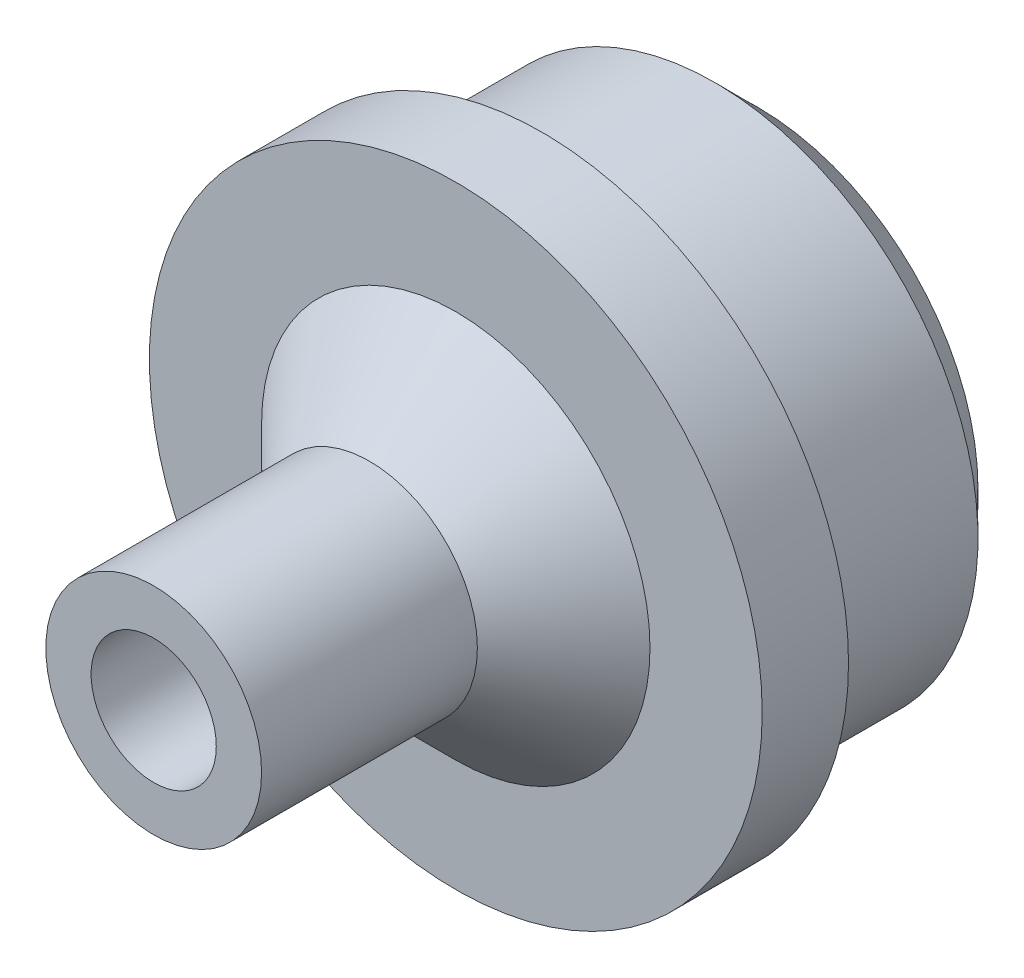
ISO-10303-21;
HEADER;
FILE_DESCRIPTION(('STEP AP214'),'2;1');
FILE_NAME('part.step','',(''),(''),'','','');
FILE_SCHEMA(('AUTOMOTIVE_DESIGN { 1 0 10303 214 1 1 1 1 }'));
ENDSEC;
DATA;
#1=APPLICATION_CONTEXT('core data for automotive mechanical design processes');
#2=APPLICATION_PROTOCOL_DEFINITION('international standard','automotive_design',2000,#1);
#3=PRODUCT_CONTEXT('',#1,'mechanical');
#4=PRODUCT('Part','Part','',(#3));
#5=PRODUCT_RELATED_PRODUCT_CATEGORY('part','',(#4));
#6=PRODUCT_DEFINITION_FORMATION('','',#4);
#7=PRODUCT_DEFINITION_CONTEXT('part definition',#1,'design');
#8=PRODUCT_DEFINITION('design','',#6,#7);
#9=PRODUCT_DEFINITION_SHAPE('','',#8);
#10=(LENGTH_UNIT() NAMED_UNIT(*) SI_UNIT(.MILLI.,.METRE.));
#11=(NAMED_UNIT(*) PLANE_ANGLE_UNIT() SI_UNIT($,.RADIAN.));
#12=(NAMED_UNIT(*) SI_UNIT($,.STERADIAN.) SOLID_ANGLE_UNIT());
#13=UNCERTAINTY_MEASURE_WITH_UNIT(LENGTH_MEASURE(1.E-05),#10,'distance_accuracy_value','');
#14=(GEOMETRIC_REPRESENTATION_CONTEXT(3) GLOBAL_UNCERTAINTY_ASSIGNED_CONTEXT((#13)) GLOBAL_UNIT_ASSIGNED_CONTEXT((#10,
#11,#12)) REPRESENTATION_CONTEXT('',''));
#15=CARTESIAN_POINT('',(0.,0.,0.));
#16=DIRECTION('',(0.,0.,1.));
#17=DIRECTION('',(1.,0.,0.));
#18=AXIS2_PLACEMENT_3D('',#15,#16,#17);
#19=CARTESIAN_POINT('',(0.,-0.874999999999985,-5.));
#20=DIRECTION('',(0.,-1.,0.));
#21=DIRECTION('',(1.,0.,0.));
#22=AXIS2_PLACEMENT_3D('',#19,#20,#21);
#23=PLANE('',#22);
#24=DIRECTION('',(1.,0.,0.));
#25=VECTOR('',#24,1.);
#26=CARTESIAN_POINT('',(0.,-0.874999999999985,0.));
#27=LINE('',#26,#25);
#28=CARTESIAN_POINT('',(-6.35,-0.875,0.));
#29=VERTEX_POINT('',#28);
#30=CARTESIAN_POINT('',(-6.03691767378022,-0.874999999999999,0.));
#31=VERTEX_POINT('',#30);
#32=EDGE_CURVE('E88',#29,#31,#27,.T.);
#33=ORIENTED_EDGE('',*,*,#32,.F.);
#34=DIRECTION('',(0.,0.,1.));
#35=VECTOR('',#34,1.);
#36=CARTESIAN_POINT('',(-6.35,-0.875,-5.));
#37=LINE('',#36,#35);
#38=CARTESIAN_POINT('',(-6.35,-0.875,-5.));
#39=VERTEX_POINT('',#38);
#40=EDGE_CURVE('E90',#39,#29,#37,.T.);
#41=ORIENTED_EDGE('',*,*,#40,.F.);
#42=DIRECTION('',(1.,0.,0.));
#43=VECTOR('',#42,1.);
#44=CARTESIAN_POINT('',(0.,-0.874999999999985,-5.));
#45=LINE('',#44,#43);
#46=CARTESIAN_POINT('',(-5.0243780709656,-0.874999999999997,-5.));
#47=VERTEX_POINT('',#46);
#48=EDGE_CURVE('E65',#39,#47,#45,.T.);
#49=ORIENTED_EDGE('',*,*,#48,.T.);
#50=CARTESIAN_POINT('',(-5.0243780709656,-0.874999999999997,-5.));
#51=CARTESIAN_POINT('',(-5.19332243294403,-0.874999999999997,-4.83352343973465));
#52=CARTESIAN_POINT('',(-5.36217291655565,-0.874999999999998,-4.66695182390504));
#53=CARTESIAN_POINT('',(-5.69968611748322,-0.874999999999998,-4.33361849056093));
#54=CARTESIAN_POINT('',(-5.86834883480981,-0.874999999999999,-4.16685677305721));
#55=CARTESIAN_POINT('',(-6.03691767378022,-0.874999999999999,-4.));
#56=B_SPLINE_CURVE_WITH_KNOTS('',3,(#50,#51,#52,#53,#54,#55),.UNSPECIFIED.,.F.,.F.,(4,2,4),(0.,
0.711554144913555,1.4231082495093),.UNSPECIFIED.);
#57=CARTESIAN_POINT('',(-6.03691767378022,-0.874999999999999,-4.));
#58=VERTEX_POINT('',#57);
#59=EDGE_CURVE('E11',#47,#58,#56,.T.);
#60=ORIENTED_EDGE('',*,*,#59,.T.);
#61=DIRECTION('',(0.,0.,1.));
#62=VECTOR('',#61,1.);
#63=CARTESIAN_POINT('',(-6.03691767378022,-0.874999999999999,-5.));
#64=LINE('',#63,#62);
#65=EDGE_CURVE('E92',#58,#31,#64,.T.);
#66=ORIENTED_EDGE('',*,*,#65,.T.);
#67=EDGE_LOOP('',(#33,#41,#49,#60,#66));
#68=FACE_BOUND('',#67,.T.);
#69=ADVANCED_FACE('F36',(#68),#23,.T.);
#70=CARTESIAN_POINT('',(-6.35,0.,-5.));
#71=DIRECTION('',(-1.,0.,0.));
#72=DIRECTION('',(0.,0.,1.));
#73=AXIS2_PLACEMENT_3D('',#70,#71,#72);
#74=PLANE('',#73);
#75=DIRECTION('',(0.,-1.,0.));
#76=VECTOR('',#75,1.);
#77=CARTESIAN_POINT('',(-6.35,0.,0.));
#78=LINE('',#77,#76);
#79=CARTESIAN_POINT('',(-6.35,0.875,0.));
#80=VERTEX_POINT('',#79);
#81=EDGE_CURVE('E104',#80,#29,#78,.T.);
#82=ORIENTED_EDGE('',*,*,#81,.F.);
#83=DIRECTION('',(0.,0.,1.));
#84=VECTOR('',#83,1.);
#85=CARTESIAN_POINT('',(-6.35,0.875,-5.));
#86=LINE('',#85,#84);
#87=CARTESIAN_POINT('',(-6.35,0.875,-5.));
#88=VERTEX_POINT('',#87);
#89=EDGE_CURVE('E108',#88,#80,#86,.T.);
#90=ORIENTED_EDGE('',*,*,#89,.F.);
#91=DIRECTION('',(0.,-1.,0.));
#92=VECTOR('',#91,1.);
#93=CARTESIAN_POINT('',(-6.35,0.,-5.));
#94=LINE('',#93,#92);
#95=EDGE_CURVE('E106',#88,#39,#94,.T.);
#96=ORIENTED_EDGE('',*,*,#95,.T.);
#97=ORIENTED_EDGE('',*,*,#40,.T.);
#98=EDGE_LOOP('',(#82,#90,#96,#97));
#99=FACE_BOUND('',#98,.T.);
#100=ADVANCED_FACE('F103',(#99),#74,.T.);
#101=CARTESIAN_POINT('',(0.,0.875,-5.));
#102=DIRECTION('',(0.,1.,0.));
#103=DIRECTION('',(0.,0.,1.));
#104=AXIS2_PLACEMENT_3D('',#101,#102,#103);
#105=PLANE('',#104);
#106=DIRECTION('',(-1.,0.,0.));
#107=VECTOR('',#106,1.);
#108=CARTESIAN_POINT('',(0.,0.875,0.));
#109=LINE('',#108,#107);
#110=CARTESIAN_POINT('',(-6.03691767378022,0.875,0.));
#111=VERTEX_POINT('',#110);
#112=EDGE_CURVE('E112',#111,#80,#109,.T.);
#113=ORIENTED_EDGE('',*,*,#112,.F.);
#114=DIRECTION('',(0.,0.,1.));
#115=VECTOR('',#114,1.);
#116=CARTESIAN_POINT('',(-6.03691767378022,0.875,-5.));
#117=LINE('',#116,#115);
#118=CARTESIAN_POINT('',(-6.03691767378022,0.875,-4.));
#119=VERTEX_POINT('',#118);
#120=EDGE_CURVE('E119',#119,#111,#117,.T.);
#121=ORIENTED_EDGE('',*,*,#120,.F.);
#122=CARTESIAN_POINT('',(-6.03691767378022,0.875,-4.));
#123=CARTESIAN_POINT('',(-5.86834883480981,0.875,-4.16685677305721));
#124=CARTESIAN_POINT('',(-5.69968611748322,0.875,-4.33361849056093));
#125=CARTESIAN_POINT('',(-5.36217291655565,0.875,-4.66695182390504));
#126=CARTESIAN_POINT('',(-5.19332243294403,0.875,-4.83352343973465));
#127=CARTESIAN_POINT('',(-5.02437807096559,0.875,-5.));
#128=B_SPLINE_CURVE_WITH_KNOTS('',3,(#122,#123,#124,#125,#126,#127),.UNSPECIFIED.,.F.,.F.,(4,2,
4),(0.,0.711554104595742,1.4231082495093),.UNSPECIFIED.);
#129=CARTESIAN_POINT('',(-5.02437807096559,0.875,-5.));
#130=VERTEX_POINT('',#129);
#131=EDGE_CURVE('E51',#119,#130,#128,.T.);
#132=ORIENTED_EDGE('',*,*,#131,.T.);
#133=DIRECTION('',(-1.,0.,0.));
#134=VECTOR('',#133,1.);
#135=CARTESIAN_POINT('',(0.,0.875,-5.));
#136=LINE('',#135,#134);
#137=EDGE_CURVE('E58',#130,#88,#136,.T.);
#138=ORIENTED_EDGE('',*,*,#137,.T.);
#139=ORIENTED_EDGE('',*,*,#89,.T.);
#140=EDGE_LOOP('',(#113,#121,#132,#138,#139));
#141=FACE_BOUND('',#140,.T.);
#142=ADVANCED_FACE('F136',(#141),#105,.T.);
#143=CARTESIAN_POINT('',(0.,0.,-5.));
#144=DIRECTION('',(0.,0.,1.));
#145=DIRECTION('',(1.,0.,0.));
#146=AXIS2_PLACEMENT_3D('',#143,#144,#145);
#147=CYLINDRICAL_SURFACE('',#146,6.1);
#148=ORIENTED_EDGE('',*,*,#65,.F.);
#149=CARTESIAN_POINT('',(0.,0.,-4.));
#150=DIRECTION('',(0.,0.,1.));
#151=DIRECTION('',(1.,0.,0.));
#152=AXIS2_PLACEMENT_3D('',#149,#150,#151);
#153=CIRCLE('',#152,6.1);
#154=EDGE_CURVE('E127',#58,#119,#153,.T.);
#155=ORIENTED_EDGE('',*,*,#154,.T.);
#156=ORIENTED_EDGE('',*,*,#120,.T.);
#157=CARTESIAN_POINT('',(0.,0.,0.));
#158=DIRECTION('',(0.,0.,1.));
#159=DIRECTION('',(1.,0.,0.));
#160=AXIS2_PLACEMENT_3D('',#157,#158,#159);
#161=CIRCLE('',#160,6.1);
#162=EDGE_CURVE('E97',#31,#111,#161,.T.);
#163=ORIENTED_EDGE('',*,*,#162,.F.);
#164=EDGE_LOOP('',(#148,#155,#156,#163));
#165=FACE_BOUND('',#164,.T.);
#166=ADVANCED_FACE('F141',(#165),#147,.T.);
#167=CARTESIAN_POINT('',(0.,0.,-5.));
#168=DIRECTION('',(0.,0.,1.));
#169=DIRECTION('',(1.,0.,0.));
#170=AXIS2_PLACEMENT_3D('',#167,#168,#169);
#171=PLANE('',#170);
#172=CARTESIAN_POINT('',(0.,0.,-5.));
#173=DIRECTION('',(0.,0.,1.));
#174=DIRECTION('',(1.,0.,0.));
#175=AXIS2_PLACEMENT_3D('',#172,#173,#174);
#176=CIRCLE('',#175,1.45);
#177=CARTESIAN_POINT('',(1.45,0.,-5.));
#178=VERTEX_POINT('',#177);
#179=EDGE_CURVE('E179',#178,#178,#176,.T.);
#180=ORIENTED_EDGE('',*,*,#179,.T.);
#181=EDGE_LOOP('',(#180));
#182=FACE_BOUND('',#181,.T.);
#183=ORIENTED_EDGE('',*,*,#137,.F.);
#184=CARTESIAN_POINT('',(0.,0.,-5.));
#185=DIRECTION('',(0.,0.,1.));
#186=DIRECTION('',(1.,0.,0.));
#187=AXIS2_PLACEMENT_3D('',#184,#185,#186);
#188=CIRCLE('',#187,5.1);
#189=EDGE_CURVE('E130',#130,#47,#188,.F.);
#190=ORIENTED_EDGE('',*,*,#189,.T.);
#191=ORIENTED_EDGE('',*,*,#48,.F.);
#192=ORIENTED_EDGE('',*,*,#95,.F.);
#193=EDGE_LOOP('',(#183,#190,#191,#192));
#194=FACE_BOUND('',#193,.T.);
#195=ADVANCED_FACE('F145',(#182,#194),#171,.F.);
#196=CARTESIAN_POINT('',(0.,0.,0.));
#197=DIRECTION('',(0.,0.,1.));
#198=DIRECTION('',(1.,0.,0.));
#199=AXIS2_PLACEMENT_3D('',#196,#197,#198);
#200=PLANE('',#199);
#201=CARTESIAN_POINT('',(0.,0.,0.));
#202=DIRECTION('',(0.,0.,1.));
#203=DIRECTION('',(1.,0.,0.));
#204=AXIS2_PLACEMENT_3D('',#201,#202,#203);
#205=CIRCLE('',#204,7.1);
#206=CARTESIAN_POINT('',(7.1,0.,0.));
#207=VERTEX_POINT('',#206);
#208=EDGE_CURVE('E178',#207,#207,#205,.T.);
#209=ORIENTED_EDGE('',*,*,#208,.F.);
#210=EDGE_LOOP('',(#209));
#211=FACE_BOUND('',#210,.T.);
#212=ORIENTED_EDGE('',*,*,#81,.T.);
#213=ORIENTED_EDGE('',*,*,#32,.T.);
#214=ORIENTED_EDGE('',*,*,#162,.T.);
#215=ORIENTED_EDGE('',*,*,#112,.T.);
#216=EDGE_LOOP('',(#212,#213,#214,#215));
#217=FACE_BOUND('',#216,.T.);
#218=ADVANCED_FACE('F110',(#211,#217),#200,.F.);
#219=CARTESIAN_POINT('',(0.,0.,2.));
#220=DIRECTION('',(0.,0.,-1.));
#221=DIRECTION('',(-1.,0.,0.));
#222=AXIS2_PLACEMENT_3D('',#219,#220,#221);
#223=CYLINDRICAL_SURFACE('',#222,7.1);
#224=CARTESIAN_POINT('',(0.,0.,2.));
#225=DIRECTION('',(0.,0.,1.));
#226=DIRECTION('',(1.,0.,0.));
#227=AXIS2_PLACEMENT_3D('',#224,#225,#226);
#228=CIRCLE('',#227,7.1);
#229=CARTESIAN_POINT('',(7.1,0.,2.));
#230=VERTEX_POINT('',#229);
#231=EDGE_CURVE('E98',#230,#230,#228,.T.);
#232=ORIENTED_EDGE('',*,*,#231,.F.);
#233=EDGE_LOOP('',(#232));
#234=FACE_BOUND('',#233,.T.);
#235=ORIENTED_EDGE('',*,*,#208,.T.);
#236=EDGE_LOOP('',(#235));
#237=FACE_BOUND('',#236,.T.);
#238=ADVANCED_FACE('F244',(#234,#237),#223,.T.);
#239=CARTESIAN_POINT('',(0.,0.,2.));
#240=DIRECTION('',(0.,0.,1.));
#241=DIRECTION('',(1.,0.,0.));
#242=AXIS2_PLACEMENT_3D('',#239,#240,#241);
#243=PLANE('',#242);
#244=CARTESIAN_POINT('',(0.,0.,2.));
#245=DIRECTION('',(0.,0.,1.));
#246=DIRECTION('',(1.,0.,0.));
#247=AXIS2_PLACEMENT_3D('',#244,#245,#246);
#248=CIRCLE('',#247,4.5);
#249=CARTESIAN_POINT('',(4.5,0.,2.));
#250=VERTEX_POINT('',#249);
#251=EDGE_CURVE('E124',#250,#250,#248,.F.);
#252=ORIENTED_EDGE('',*,*,#251,.T.);
#253=EDGE_LOOP('',(#252));
#254=FACE_BOUND('',#253,.T.);
#255=ORIENTED_EDGE('',*,*,#231,.T.);
#256=EDGE_LOOP('',(#255));
#257=FACE_BOUND('',#256,.T.);
#258=ADVANCED_FACE('F172',(#254,#257),#243,.T.);
#259=CARTESIAN_POINT('',(0.,0.,9.));
#260=DIRECTION('',(0.,0.,-1.));
#261=DIRECTION('',(-1.,0.,0.));
#262=AXIS2_PLACEMENT_3D('',#259,#260,#261);
#263=CYLINDRICAL_SURFACE('',#262,2.5);
#264=CARTESIAN_POINT('',(0.,0.,4.00000000000002));
#265=DIRECTION('',(0.,0.,1.));
#266=DIRECTION('',(1.,0.,0.));
#267=AXIS2_PLACEMENT_3D('',#264,#265,#266);
#268=CIRCLE('',#267,2.5);
#269=CARTESIAN_POINT('',(2.5,0.,4.00000000000002));
#270=VERTEX_POINT('',#269);
#271=EDGE_CURVE('E107',#270,#270,#268,.T.);
#272=ORIENTED_EDGE('',*,*,#271,.T.);
#273=EDGE_LOOP('',(#272));
#274=FACE_BOUND('',#273,.T.);
#275=CARTESIAN_POINT('',(0.,0.,9.));
#276=DIRECTION('',(0.,0.,1.));
#277=DIRECTION('',(1.,0.,0.));
#278=AXIS2_PLACEMENT_3D('',#275,#276,#277);
#279=CIRCLE('',#278,2.5);
#280=CARTESIAN_POINT('',(2.5,0.,9.));
#281=VERTEX_POINT('',#280);
#282=EDGE_CURVE('E176',#281,#281,#279,.T.);
#283=ORIENTED_EDGE('',*,*,#282,.F.);
#284=EDGE_LOOP('',(#283));
#285=FACE_BOUND('',#284,.T.);
#286=ADVANCED_FACE('F163',(#274,#285),#263,.T.);
#287=CARTESIAN_POINT('',(0.,0.,9.));
#288=DIRECTION('',(0.,0.,1.));
#289=DIRECTION('',(1.,0.,0.));
#290=AXIS2_PLACEMENT_3D('',#287,#288,#289);
#291=PLANE('',#290);
#292=CARTESIAN_POINT('',(0.,0.,9.));
#293=DIRECTION('',(0.,0.,1.));
#294=DIRECTION('',(1.,0.,0.));
#295=AXIS2_PLACEMENT_3D('',#292,#293,#294);
#296=CIRCLE('',#295,1.45);
#297=CARTESIAN_POINT('',(1.45,0.,9.));
#298=VERTEX_POINT('',#297);
#299=EDGE_CURVE('E184',#298,#298,#296,.T.);
#300=ORIENTED_EDGE('',*,*,#299,.F.);
#301=EDGE_LOOP('',(#300));
#302=FACE_BOUND('',#301,.T.);
#303=ORIENTED_EDGE('',*,*,#282,.T.);
#304=EDGE_LOOP('',(#303));
#305=FACE_BOUND('',#304,.T.);
#306=ADVANCED_FACE('F155',(#302,#305),#291,.T.);
#307=CARTESIAN_POINT('',(0.,0.,4.00000000000002));
#308=DIRECTION('',(0.,0.,-1.));
#309=DIRECTION('',(-1.,0.,0.));
#310=AXIS2_PLACEMENT_3D('',#307,#308,#309);
#311=CONICAL_SURFACE('',#310,2.5,0.785398163397444);
#312=ORIENTED_EDGE('',*,*,#251,.F.);
#313=EDGE_LOOP('',(#312));
#314=FACE_BOUND('',#313,.T.);
#315=ORIENTED_EDGE('',*,*,#271,.F.);
#316=EDGE_LOOP('',(#315));
#317=FACE_BOUND('',#316,.T.);
#318=ADVANCED_FACE('F150',(#314,#317),#311,.T.);
#319=CARTESIAN_POINT('',(0.,0.,-21.));
#320=DIRECTION('',(0.,0.,1.));
#321=DIRECTION('',(1.,0.,0.));
#322=AXIS2_PLACEMENT_3D('',#319,#320,#321);
#323=CYLINDRICAL_SURFACE('',#322,1.45);
#324=ORIENTED_EDGE('',*,*,#299,.T.);
#325=EDGE_LOOP('',(#324));
#326=FACE_BOUND('',#325,.T.);
#327=ORIENTED_EDGE('',*,*,#179,.F.);
#328=EDGE_LOOP('',(#327));
#329=FACE_BOUND('',#328,.T.);
#330=ADVANCED_FACE('F154',(#326,#329),#323,.F.);
#331=CARTESIAN_POINT('',(0.,0.,-4.));
#332=DIRECTION('',(0.,0.,1.));
#333=DIRECTION('',(1.,0.,0.));
#334=AXIS2_PLACEMENT_3D('',#331,#332,#333);
#335=CONICAL_SURFACE('',#334,6.1,0.78539816339745);
#336=ORIENTED_EDGE('',*,*,#59,.F.);
#337=ORIENTED_EDGE('',*,*,#189,.F.);
#338=ORIENTED_EDGE('',*,*,#131,.F.);
#339=ORIENTED_EDGE('',*,*,#154,.F.);
#340=EDGE_LOOP('',(#336,#337,#338,#339));
#341=FACE_BOUND('',#340,.T.);
#342=ADVANCED_FACE('F39',(#341),#335,.T.);
#343=CLOSED_SHELL('',(#69,#100,#142,#166,#195,#218,#238,#258,#286,#306,#318,#330,#342));
#344=MANIFOLD_SOLID_BREP('B2',#343);
#345=ADVANCED_BREP_SHAPE_REPRESENTATION('',(#18,#344),#14);
#346=SHAPE_DEFINITION_REPRESENTATION(#9,#345);
ENDSEC;
END-ISO-10303-21;
